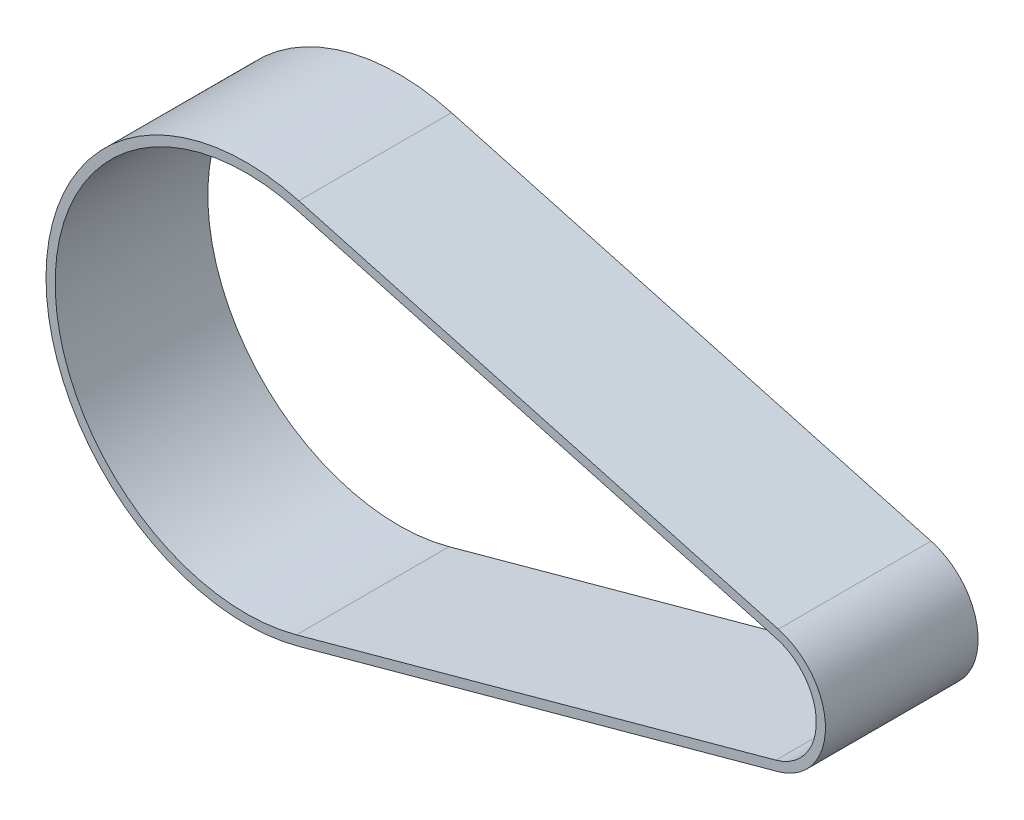
ISO-10303-21;
HEADER;
FILE_DESCRIPTION(('STEP AP214'),'2;1');
FILE_NAME('part.step','',(''),(''),'','','');
FILE_SCHEMA(('AUTOMOTIVE_DESIGN { 1 0 10303 214 1 1 1 1 }'));
ENDSEC;
DATA;
#1=APPLICATION_CONTEXT('core data for automotive mechanical design processes');
#2=APPLICATION_PROTOCOL_DEFINITION('international standard','automotive_design',2000,#1);
#3=PRODUCT_CONTEXT('',#1,'mechanical');
#4=PRODUCT('Part','Part','',(#3));
#5=PRODUCT_RELATED_PRODUCT_CATEGORY('part','',(#4));
#6=PRODUCT_DEFINITION_FORMATION('','',#4);
#7=PRODUCT_DEFINITION_CONTEXT('part definition',#1,'design');
#8=PRODUCT_DEFINITION('design','',#6,#7);
#9=PRODUCT_DEFINITION_SHAPE('','',#8);
#10=(LENGTH_UNIT() NAMED_UNIT(*) SI_UNIT(.MILLI.,.METRE.));
#11=(NAMED_UNIT(*) PLANE_ANGLE_UNIT() SI_UNIT($,.RADIAN.));
#12=(NAMED_UNIT(*) SI_UNIT($,.STERADIAN.) SOLID_ANGLE_UNIT());
#13=UNCERTAINTY_MEASURE_WITH_UNIT(LENGTH_MEASURE(1.E-05),#10,'distance_accuracy_value','');
#14=(GEOMETRIC_REPRESENTATION_CONTEXT(3) GLOBAL_UNCERTAINTY_ASSIGNED_CONTEXT((#13)) GLOBAL_UNIT_ASSIGNED_CONTEXT((#10,
#11,#12)) REPRESENTATION_CONTEXT('',''));
#15=CARTESIAN_POINT('',(0.,0.,0.));
#16=DIRECTION('',(0.,0.,1.));
#17=DIRECTION('',(1.,0.,0.));
#18=AXIS2_PLACEMENT_3D('',#15,#16,#17);
#19=CARTESIAN_POINT('',(-84.3999999999999,-1.23737310048955E-13,25.));
#20=DIRECTION('',(0.,0.,1.));
#21=DIRECTION('',(1.,0.,0.));
#22=AXIS2_PLACEMENT_3D('',#19,#20,#21);
#23=PLANE('',#22);
#24=CARTESIAN_POINT('',(-84.3999999999999,-1.23737310048955E-13,25.));
#25=DIRECTION('',(0.,0.,1.));
#26=DIRECTION('',(1.,0.,0.));
#27=AXIS2_PLACEMENT_3D('',#24,#25,#26);
#28=CIRCLE('',#27,32.76);
#29=CARTESIAN_POINT('',(-75.751981042654,31.5979329721643,25.));
#30=VERTEX_POINT('',#29);
#31=CARTESIAN_POINT('',(-75.751981042654,-31.5979329721643,25.));
#32=VERTEX_POINT('',#31);
#33=EDGE_CURVE('E134',#30,#32,#28,.T.);
#34=ORIENTED_EDGE('',*,*,#33,.T.);
#35=DIRECTION('',(0.964527868503182,0.263981042654029,0.));
#36=VECTOR('',#35,1.);
#37=CARTESIAN_POINT('',(-75.751981042654,-31.5979329721643,25.));
#38=LINE('',#37,#36);
#39=CARTESIAN_POINT('',(2.76652132701422,-10.1082520619134,25.));
#40=VERTEX_POINT('',#39);
#41=EDGE_CURVE('E137',#32,#40,#38,.T.);
#42=ORIENTED_EDGE('',*,*,#41,.T.);
#43=CARTESIAN_POINT('',(0.,0.,25.));
#44=DIRECTION('',(0.,0.,1.));
#45=DIRECTION('',(1.,0.,0.));
#46=AXIS2_PLACEMENT_3D('',#43,#44,#45);
#47=CIRCLE('',#46,10.48);
#48=CARTESIAN_POINT('',(2.76652132701422,10.1082520619134,25.));
#49=VERTEX_POINT('',#48);
#50=EDGE_CURVE('E140',#40,#49,#47,.T.);
#51=ORIENTED_EDGE('',*,*,#50,.T.);
#52=DIRECTION('',(-0.964527868503182,0.263981042654029,0.));
#53=VECTOR('',#52,1.);
#54=CARTESIAN_POINT('',(-75.751981042654,31.5979329721643,25.));
#55=LINE('',#54,#53);
#56=EDGE_CURVE('E142',#49,#30,#55,.T.);
#57=ORIENTED_EDGE('',*,*,#56,.T.);
#58=EDGE_LOOP('',(#34,#42,#51,#57));
#59=FACE_BOUND('',#58,.T.);
#60=DIRECTION('',(0.964527868503182,0.263981042654029,0.));
#61=VECTOR('',#60,1.);
#62=CARTESIAN_POINT('',(-76.147952606635,-30.1511411694095,25.));
#63=LINE('',#62,#61);
#64=CARTESIAN_POINT('',(-76.147952606635,-30.1511411694095,25.));
#65=VERTEX_POINT('',#64);
#66=CARTESIAN_POINT('',(2.37054976303319,-8.66146025915858,25.));
#67=VERTEX_POINT('',#66);
#68=EDGE_CURVE('E106',#65,#67,#63,.T.);
#69=ORIENTED_EDGE('',*,*,#68,.F.);
#70=CARTESIAN_POINT('',(-84.3999999999999,-1.23737310048955E-13,25.));
#71=DIRECTION('',(0.,0.,1.));
#72=DIRECTION('',(1.,0.,0.));
#73=AXIS2_PLACEMENT_3D('',#70,#71,#72);
#74=CIRCLE('',#73,31.26);
#75=CARTESIAN_POINT('',(-76.147952606635,30.1511411694095,25.));
#76=VERTEX_POINT('',#75);
#77=EDGE_CURVE('E98',#76,#65,#74,.T.);
#78=ORIENTED_EDGE('',*,*,#77,.F.);
#79=DIRECTION('',(-0.964527868503182,0.263981042654029,0.));
#80=VECTOR('',#79,1.);
#81=CARTESIAN_POINT('',(-76.147952606635,30.1511411694095,25.));
#82=LINE('',#81,#80);
#83=CARTESIAN_POINT('',(2.37054976303318,8.66146025915859,25.));
#84=VERTEX_POINT('',#83);
#85=EDGE_CURVE('E120',#84,#76,#82,.T.);
#86=ORIENTED_EDGE('',*,*,#85,.F.);
#87=CARTESIAN_POINT('',(0.,0.,25.));
#88=DIRECTION('',(0.,0.,1.));
#89=DIRECTION('',(1.,0.,0.));
#90=AXIS2_PLACEMENT_3D('',#87,#88,#89);
#91=CIRCLE('',#90,8.98000000000001);
#92=EDGE_CURVE('E118',#67,#84,#91,.T.);
#93=ORIENTED_EDGE('',*,*,#92,.F.);
#94=EDGE_LOOP('',(#69,#78,#86,#93));
#95=FACE_BOUND('',#94,.T.);
#96=ADVANCED_FACE('F33',(#59,#95),#23,.T.);
#97=CARTESIAN_POINT('',(-84.3999999999999,-1.23737310048955E-13,0.));
#98=DIRECTION('',(0.,0.,1.));
#99=DIRECTION('',(1.,0.,0.));
#100=AXIS2_PLACEMENT_3D('',#97,#98,#99);
#101=PLANE('',#100);
#102=CARTESIAN_POINT('',(-84.3999999999999,-1.23737310048955E-13,0.));
#103=DIRECTION('',(0.,0.,1.));
#104=DIRECTION('',(1.,0.,0.));
#105=AXIS2_PLACEMENT_3D('',#102,#103,#104);
#106=CIRCLE('',#105,32.76);
#107=CARTESIAN_POINT('',(-75.751981042654,31.5979329721643,0.));
#108=VERTEX_POINT('',#107);
#109=CARTESIAN_POINT('',(-75.751981042654,-31.5979329721643,0.));
#110=VERTEX_POINT('',#109);
#111=EDGE_CURVE('E114',#108,#110,#106,.T.);
#112=ORIENTED_EDGE('',*,*,#111,.F.);
#113=DIRECTION('',(-0.964527868503182,0.263981042654029,0.));
#114=VECTOR('',#113,1.);
#115=CARTESIAN_POINT('',(-75.751981042654,31.5979329721643,0.));
#116=LINE('',#115,#114);
#117=CARTESIAN_POINT('',(2.76652132701422,10.1082520619134,0.));
#118=VERTEX_POINT('',#117);
#119=EDGE_CURVE('E138',#118,#108,#116,.T.);
#120=ORIENTED_EDGE('',*,*,#119,.F.);
#121=CARTESIAN_POINT('',(0.,0.,0.));
#122=DIRECTION('',(0.,0.,1.));
#123=DIRECTION('',(1.,0.,0.));
#124=AXIS2_PLACEMENT_3D('',#121,#122,#123);
#125=CIRCLE('',#124,10.48);
#126=CARTESIAN_POINT('',(2.76652132701422,-10.1082520619134,0.));
#127=VERTEX_POINT('',#126);
#128=EDGE_CURVE('E149',#127,#118,#125,.T.);
#129=ORIENTED_EDGE('',*,*,#128,.F.);
#130=DIRECTION('',(0.964527868503182,0.263981042654029,0.));
#131=VECTOR('',#130,1.);
#132=CARTESIAN_POINT('',(-75.751981042654,-31.5979329721643,0.));
#133=LINE('',#132,#131);
#134=EDGE_CURVE('E147',#110,#127,#133,.T.);
#135=ORIENTED_EDGE('',*,*,#134,.F.);
#136=EDGE_LOOP('',(#112,#120,#129,#135));
#137=FACE_BOUND('',#136,.T.);
#138=CARTESIAN_POINT('',(-84.3999999999999,-1.23737310048955E-13,0.));
#139=DIRECTION('',(0.,0.,1.));
#140=DIRECTION('',(1.,0.,0.));
#141=AXIS2_PLACEMENT_3D('',#138,#139,#140);
#142=CIRCLE('',#141,31.26);
#143=CARTESIAN_POINT('',(-76.147952606635,30.1511411694095,0.));
#144=VERTEX_POINT('',#143);
#145=CARTESIAN_POINT('',(-76.147952606635,-30.1511411694095,0.));
#146=VERTEX_POINT('',#145);
#147=EDGE_CURVE('E56',#144,#146,#142,.T.);
#148=ORIENTED_EDGE('',*,*,#147,.T.);
#149=DIRECTION('',(0.964527868503182,0.263981042654029,0.));
#150=VECTOR('',#149,1.);
#151=CARTESIAN_POINT('',(-76.147952606635,-30.1511411694095,0.));
#152=LINE('',#151,#150);
#153=CARTESIAN_POINT('',(2.37054976303319,-8.66146025915858,0.));
#154=VERTEX_POINT('',#153);
#155=EDGE_CURVE('E113',#146,#154,#152,.T.);
#156=ORIENTED_EDGE('',*,*,#155,.T.);
#157=CARTESIAN_POINT('',(0.,0.,0.));
#158=DIRECTION('',(0.,0.,1.));
#159=DIRECTION('',(1.,0.,0.));
#160=AXIS2_PLACEMENT_3D('',#157,#158,#159);
#161=CIRCLE('',#160,8.98000000000001);
#162=CARTESIAN_POINT('',(2.37054976303318,8.66146025915858,0.));
#163=VERTEX_POINT('',#162);
#164=EDGE_CURVE('E126',#154,#163,#161,.T.);
#165=ORIENTED_EDGE('',*,*,#164,.T.);
#166=DIRECTION('',(-0.964527868503182,0.263981042654029,0.));
#167=VECTOR('',#166,1.);
#168=CARTESIAN_POINT('',(-76.147952606635,30.1511411694095,0.));
#169=LINE('',#168,#167);
#170=EDGE_CURVE('E107',#163,#144,#169,.T.);
#171=ORIENTED_EDGE('',*,*,#170,.T.);
#172=EDGE_LOOP('',(#148,#156,#165,#171));
#173=FACE_BOUND('',#172,.T.);
#174=ADVANCED_FACE('F167',(#137,#173),#101,.F.);
#175=CARTESIAN_POINT('',(-84.3999999999999,-1.23737310048955E-13,25.));
#176=DIRECTION('',(0.,0.,-1.));
#177=DIRECTION('',(-1.,0.,0.));
#178=AXIS2_PLACEMENT_3D('',#175,#176,#177);
#179=CYLINDRICAL_SURFACE('',#178,32.76);
#180=ORIENTED_EDGE('',*,*,#111,.T.);
#181=DIRECTION('',(0.,0.,-1.));
#182=VECTOR('',#181,1.);
#183=CARTESIAN_POINT('',(-75.751981042654,-31.5979329721643,25.));
#184=LINE('',#183,#182);
#185=EDGE_CURVE('E11',#32,#110,#184,.T.);
#186=ORIENTED_EDGE('',*,*,#185,.F.);
#187=ORIENTED_EDGE('',*,*,#33,.F.);
#188=DIRECTION('',(0.,0.,-1.));
#189=VECTOR('',#188,1.);
#190=CARTESIAN_POINT('',(-75.751981042654,31.5979329721643,25.));
#191=LINE('',#190,#189);
#192=EDGE_CURVE('E144',#30,#108,#191,.T.);
#193=ORIENTED_EDGE('',*,*,#192,.T.);
#194=EDGE_LOOP('',(#180,#186,#187,#193));
#195=FACE_BOUND('',#194,.T.);
#196=ADVANCED_FACE('F35',(#195),#179,.T.);
#197=CARTESIAN_POINT('',(-75.751981042654,-31.5979329721643,25.));
#198=DIRECTION('',(-0.263981042654029,0.964527868503182,0.));
#199=DIRECTION('',(-0.964527868503182,-0.263981042654029,0.));
#200=AXIS2_PLACEMENT_3D('',#197,#198,#199);
#201=PLANE('',#200);
#202=ORIENTED_EDGE('',*,*,#134,.T.);
#203=DIRECTION('',(0.,0.,-1.));
#204=VECTOR('',#203,1.);
#205=CARTESIAN_POINT('',(2.76652132701422,-10.1082520619134,25.));
#206=LINE('',#205,#204);
#207=EDGE_CURVE('E41',#40,#127,#206,.T.);
#208=ORIENTED_EDGE('',*,*,#207,.F.);
#209=ORIENTED_EDGE('',*,*,#41,.F.);
#210=ORIENTED_EDGE('',*,*,#185,.T.);
#211=EDGE_LOOP('',(#202,#208,#209,#210));
#212=FACE_BOUND('',#211,.T.);
#213=ADVANCED_FACE('F177',(#212),#201,.F.);
#214=CARTESIAN_POINT('',(0.,0.,25.));
#215=DIRECTION('',(0.,0.,-1.));
#216=DIRECTION('',(-1.,0.,0.));
#217=AXIS2_PLACEMENT_3D('',#214,#215,#216);
#218=CYLINDRICAL_SURFACE('',#217,10.48);
#219=ORIENTED_EDGE('',*,*,#128,.T.);
#220=DIRECTION('',(0.,0.,-1.));
#221=VECTOR('',#220,1.);
#222=CARTESIAN_POINT('',(2.76652132701422,10.1082520619134,25.));
#223=LINE('',#222,#221);
#224=EDGE_CURVE('E154',#49,#118,#223,.T.);
#225=ORIENTED_EDGE('',*,*,#224,.F.);
#226=ORIENTED_EDGE('',*,*,#50,.F.);
#227=ORIENTED_EDGE('',*,*,#207,.T.);
#228=EDGE_LOOP('',(#219,#225,#226,#227));
#229=FACE_BOUND('',#228,.T.);
#230=ADVANCED_FACE('F161',(#229),#218,.T.);
#231=CARTESIAN_POINT('',(-75.751981042654,31.5979329721643,25.));
#232=DIRECTION('',(-0.263981042654029,-0.964527868503182,0.));
#233=DIRECTION('',(0.964527868503182,-0.263981042654029,0.));
#234=AXIS2_PLACEMENT_3D('',#231,#232,#233);
#235=PLANE('',#234);
#236=ORIENTED_EDGE('',*,*,#119,.T.);
#237=ORIENTED_EDGE('',*,*,#192,.F.);
#238=ORIENTED_EDGE('',*,*,#56,.F.);
#239=ORIENTED_EDGE('',*,*,#224,.T.);
#240=EDGE_LOOP('',(#236,#237,#238,#239));
#241=FACE_BOUND('',#240,.T.);
#242=ADVANCED_FACE('F171',(#241),#235,.F.);
#243=CARTESIAN_POINT('',(-84.3999999999999,-1.23737310048955E-13,25.));
#244=DIRECTION('',(0.,0.,-1.));
#245=DIRECTION('',(-1.,0.,0.));
#246=AXIS2_PLACEMENT_3D('',#243,#244,#245);
#247=CYLINDRICAL_SURFACE('',#246,31.26);
#248=ORIENTED_EDGE('',*,*,#147,.F.);
#249=DIRECTION('',(0.,0.,-1.));
#250=VECTOR('',#249,1.);
#251=CARTESIAN_POINT('',(-76.147952606635,30.1511411694095,25.));
#252=LINE('',#251,#250);
#253=EDGE_CURVE('E102',#76,#144,#252,.T.);
#254=ORIENTED_EDGE('',*,*,#253,.F.);
#255=ORIENTED_EDGE('',*,*,#77,.T.);
#256=DIRECTION('',(0.,0.,-1.));
#257=VECTOR('',#256,1.);
#258=CARTESIAN_POINT('',(-76.147952606635,-30.1511411694095,25.));
#259=LINE('',#258,#257);
#260=EDGE_CURVE('E101',#65,#146,#259,.T.);
#261=ORIENTED_EDGE('',*,*,#260,.T.);
#262=EDGE_LOOP('',(#248,#254,#255,#261));
#263=FACE_BOUND('',#262,.T.);
#264=ADVANCED_FACE('F100',(#263),#247,.F.);
#265=CARTESIAN_POINT('',(-76.147952606635,-30.1511411694095,25.));
#266=DIRECTION('',(-0.263981042654029,0.964527868503182,0.));
#267=DIRECTION('',(-0.964527868503182,-0.263981042654029,0.));
#268=AXIS2_PLACEMENT_3D('',#265,#266,#267);
#269=PLANE('',#268);
#270=ORIENTED_EDGE('',*,*,#155,.F.);
#271=ORIENTED_EDGE('',*,*,#260,.F.);
#272=ORIENTED_EDGE('',*,*,#68,.T.);
#273=DIRECTION('',(0.,0.,-1.));
#274=VECTOR('',#273,1.);
#275=CARTESIAN_POINT('',(2.37054976303319,-8.66146025915858,25.));
#276=LINE('',#275,#274);
#277=EDGE_CURVE('E115',#67,#154,#276,.T.);
#278=ORIENTED_EDGE('',*,*,#277,.T.);
#279=EDGE_LOOP('',(#270,#271,#272,#278));
#280=FACE_BOUND('',#279,.T.);
#281=ADVANCED_FACE('F110',(#280),#269,.T.);
#282=CARTESIAN_POINT('',(0.,0.,25.));
#283=DIRECTION('',(0.,0.,-1.));
#284=DIRECTION('',(-1.,0.,0.));
#285=AXIS2_PLACEMENT_3D('',#282,#283,#284);
#286=CYLINDRICAL_SURFACE('',#285,8.98000000000001);
#287=ORIENTED_EDGE('',*,*,#164,.F.);
#288=ORIENTED_EDGE('',*,*,#277,.F.);
#289=ORIENTED_EDGE('',*,*,#92,.T.);
#290=DIRECTION('',(0.,0.,-1.));
#291=VECTOR('',#290,1.);
#292=CARTESIAN_POINT('',(2.37054976303318,8.66146025915858,25.));
#293=LINE('',#292,#291);
#294=EDGE_CURVE('E48',#84,#163,#293,.T.);
#295=ORIENTED_EDGE('',*,*,#294,.T.);
#296=EDGE_LOOP('',(#287,#288,#289,#295));
#297=FACE_BOUND('',#296,.T.);
#298=ADVANCED_FACE('F200',(#297),#286,.F.);
#299=CARTESIAN_POINT('',(-76.147952606635,30.1511411694095,25.));
#300=DIRECTION('',(-0.263981042654029,-0.964527868503182,0.));
#301=DIRECTION('',(0.964527868503182,-0.263981042654029,0.));
#302=AXIS2_PLACEMENT_3D('',#299,#300,#301);
#303=PLANE('',#302);
#304=ORIENTED_EDGE('',*,*,#170,.F.);
#305=ORIENTED_EDGE('',*,*,#294,.F.);
#306=ORIENTED_EDGE('',*,*,#85,.T.);
#307=ORIENTED_EDGE('',*,*,#253,.T.);
#308=EDGE_LOOP('',(#304,#305,#306,#307));
#309=FACE_BOUND('',#308,.T.);
#310=ADVANCED_FACE('F204',(#309),#303,.T.);
#311=CLOSED_SHELL('',(#96,#174,#196,#213,#230,#242,#264,#281,#298,#310));
#312=MANIFOLD_SOLID_BREP('B2',#311);
#313=ADVANCED_BREP_SHAPE_REPRESENTATION('',(#18,#312),#14);
#314=SHAPE_DEFINITION_REPRESENTATION(#9,#313);
ENDSEC;
END-ISO-10303-21;
